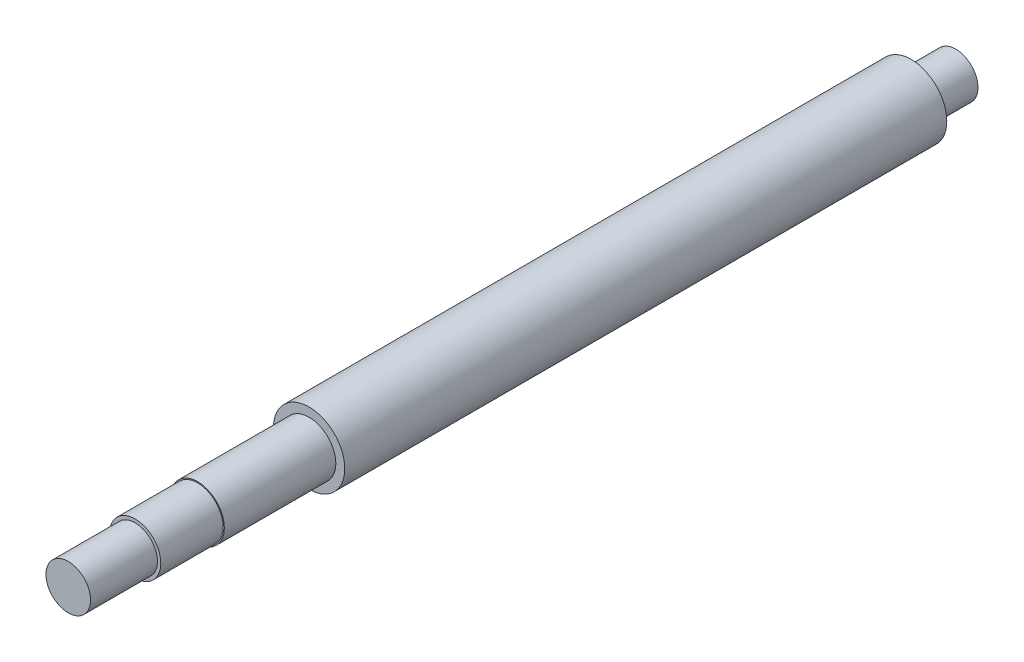
ISO-10303-21;
HEADER;
FILE_DESCRIPTION(('STEP AP214'),'2;1');
FILE_NAME('part.step','',(''),(''),'','','');
FILE_SCHEMA(('AUTOMOTIVE_DESIGN { 1 0 10303 214 1 1 1 1 }'));
ENDSEC;
DATA;
#1=APPLICATION_CONTEXT('core data for automotive mechanical design processes');
#2=APPLICATION_PROTOCOL_DEFINITION('international standard','automotive_design',2000,#1);
#3=PRODUCT_CONTEXT('',#1,'mechanical');
#4=PRODUCT('Part','Part','',(#3));
#5=PRODUCT_RELATED_PRODUCT_CATEGORY('part','',(#4));
#6=PRODUCT_DEFINITION_FORMATION('','',#4);
#7=PRODUCT_DEFINITION_CONTEXT('part definition',#1,'design');
#8=PRODUCT_DEFINITION('design','',#6,#7);
#9=PRODUCT_DEFINITION_SHAPE('','',#8);
#10=(LENGTH_UNIT() NAMED_UNIT(*) SI_UNIT(.MILLI.,.METRE.));
#11=(NAMED_UNIT(*) PLANE_ANGLE_UNIT() SI_UNIT($,.RADIAN.));
#12=(NAMED_UNIT(*) SI_UNIT($,.STERADIAN.) SOLID_ANGLE_UNIT());
#13=UNCERTAINTY_MEASURE_WITH_UNIT(LENGTH_MEASURE(1.E-05),#10,'distance_accuracy_value','');
#14=(GEOMETRIC_REPRESENTATION_CONTEXT(3) GLOBAL_UNCERTAINTY_ASSIGNED_CONTEXT((#13)) GLOBAL_UNIT_ASSIGNED_CONTEXT((#10,
#11,#12)) REPRESENTATION_CONTEXT('',''));
#15=CARTESIAN_POINT('',(0.,0.,0.));
#16=DIRECTION('',(0.,0.,1.));
#17=DIRECTION('',(1.,0.,0.));
#18=AXIS2_PLACEMENT_3D('',#15,#16,#17);
#19=CARTESIAN_POINT('',(0.,0.,10.));
#20=DIRECTION('',(0.,0.,-1.));
#21=DIRECTION('',(-1.,0.,0.));
#22=AXIS2_PLACEMENT_3D('',#19,#20,#21);
#23=CYLINDRICAL_SURFACE('',#22,5.);
#24=CARTESIAN_POINT('',(0.,0.,10.));
#25=DIRECTION('',(0.,0.,1.));
#26=DIRECTION('',(1.,0.,0.));
#27=AXIS2_PLACEMENT_3D('',#24,#25,#26);
#28=CIRCLE('',#27,5.);
#29=CARTESIAN_POINT('',(5.,0.,10.));
#30=VERTEX_POINT('',#29);
#31=EDGE_CURVE('E64',#30,#30,#28,.T.);
#32=ORIENTED_EDGE('',*,*,#31,.F.);
#33=EDGE_LOOP('',(#32));
#34=FACE_BOUND('',#33,.T.);
#35=CARTESIAN_POINT('',(0.,0.,0.));
#36=DIRECTION('',(0.,0.,1.));
#37=DIRECTION('',(1.,0.,0.));
#38=AXIS2_PLACEMENT_3D('',#35,#36,#37);
#39=CIRCLE('',#38,5.);
#40=CARTESIAN_POINT('',(5.,0.,0.));
#41=VERTEX_POINT('',#40);
#42=EDGE_CURVE('E41',#41,#41,#39,.T.);
#43=ORIENTED_EDGE('',*,*,#42,.T.);
#44=EDGE_LOOP('',(#43));
#45=FACE_BOUND('',#44,.T.);
#46=ADVANCED_FACE('F38',(#34,#45),#23,.T.);
#47=CARTESIAN_POINT('',(0.,0.,0.));
#48=DIRECTION('',(0.,0.,1.));
#49=DIRECTION('',(1.,0.,0.));
#50=AXIS2_PLACEMENT_3D('',#47,#48,#49);
#51=PLANE('',#50);
#52=ORIENTED_EDGE('',*,*,#42,.F.);
#53=EDGE_LOOP('',(#52));
#54=FACE_BOUND('',#53,.T.);
#55=ADVANCED_FACE('F76',(#54),#51,.F.);
#56=CARTESIAN_POINT('',(0.,0.,145.));
#57=DIRECTION('',(0.,0.,-1.));
#58=DIRECTION('',(-1.,0.,0.));
#59=AXIS2_PLACEMENT_3D('',#56,#57,#58);
#60=CYLINDRICAL_SURFACE('',#59,8.);
#61=CARTESIAN_POINT('',(0.,0.,145.));
#62=DIRECTION('',(0.,0.,1.));
#63=DIRECTION('',(1.,0.,0.));
#64=AXIS2_PLACEMENT_3D('',#61,#62,#63);
#65=CIRCLE('',#64,8.);
#66=CARTESIAN_POINT('',(8.,0.,145.));
#67=VERTEX_POINT('',#66);
#68=EDGE_CURVE('E65',#67,#67,#65,.T.);
#69=ORIENTED_EDGE('',*,*,#68,.F.);
#70=EDGE_LOOP('',(#69));
#71=FACE_BOUND('',#70,.T.);
#72=CARTESIAN_POINT('',(0.,0.,10.));
#73=DIRECTION('',(0.,0.,1.));
#74=DIRECTION('',(1.,0.,0.));
#75=AXIS2_PLACEMENT_3D('',#72,#73,#74);
#76=CIRCLE('',#75,8.);
#77=CARTESIAN_POINT('',(8.,0.,10.));
#78=VERTEX_POINT('',#77);
#79=EDGE_CURVE('E61',#78,#78,#76,.T.);
#80=ORIENTED_EDGE('',*,*,#79,.T.);
#81=EDGE_LOOP('',(#80));
#82=FACE_BOUND('',#81,.T.);
#83=ADVANCED_FACE('F78',(#71,#82),#60,.T.);
#84=CARTESIAN_POINT('',(0.,0.,145.));
#85=DIRECTION('',(0.,0.,1.));
#86=DIRECTION('',(1.,0.,0.));
#87=AXIS2_PLACEMENT_3D('',#84,#85,#86);
#88=PLANE('',#87);
#89=CARTESIAN_POINT('',(0.,0.,145.));
#90=DIRECTION('',(0.,0.,1.));
#91=DIRECTION('',(1.,0.,0.));
#92=AXIS2_PLACEMENT_3D('',#89,#90,#91);
#93=CIRCLE('',#92,6.);
#94=CARTESIAN_POINT('',(6.,0.,145.));
#95=VERTEX_POINT('',#94);
#96=EDGE_CURVE('E50',#95,#95,#93,.T.);
#97=ORIENTED_EDGE('',*,*,#96,.F.);
#98=EDGE_LOOP('',(#97));
#99=FACE_BOUND('',#98,.T.);
#100=ORIENTED_EDGE('',*,*,#68,.T.);
#101=EDGE_LOOP('',(#100));
#102=FACE_BOUND('',#101,.T.);
#103=ADVANCED_FACE('F83',(#99,#102),#88,.T.);
#104=CARTESIAN_POINT('',(0.,0.,10.));
#105=DIRECTION('',(0.,0.,1.));
#106=DIRECTION('',(1.,0.,0.));
#107=AXIS2_PLACEMENT_3D('',#104,#105,#106);
#108=PLANE('',#107);
#109=ORIENTED_EDGE('',*,*,#31,.T.);
#110=EDGE_LOOP('',(#109));
#111=FACE_BOUND('',#110,.T.);
#112=ORIENTED_EDGE('',*,*,#79,.F.);
#113=EDGE_LOOP('',(#112));
#114=FACE_BOUND('',#113,.T.);
#115=ADVANCED_FACE('F88',(#111,#114),#108,.F.);
#116=CARTESIAN_POINT('',(0.,0.,170.));
#117=DIRECTION('',(0.,0.,-1.));
#118=DIRECTION('',(-1.,0.,0.));
#119=AXIS2_PLACEMENT_3D('',#116,#117,#118);
#120=CYLINDRICAL_SURFACE('',#119,6.);
#121=CARTESIAN_POINT('',(0.,0.,170.));
#122=DIRECTION('',(0.,0.,1.));
#123=DIRECTION('',(1.,0.,0.));
#124=AXIS2_PLACEMENT_3D('',#121,#122,#123);
#125=CIRCLE('',#124,6.);
#126=CARTESIAN_POINT('',(6.,0.,170.));
#127=VERTEX_POINT('',#126);
#128=EDGE_CURVE('E57',#127,#127,#125,.T.);
#129=ORIENTED_EDGE('',*,*,#128,.F.);
#130=EDGE_LOOP('',(#129));
#131=FACE_BOUND('',#130,.T.);
#132=ORIENTED_EDGE('',*,*,#96,.T.);
#133=EDGE_LOOP('',(#132));
#134=FACE_BOUND('',#133,.T.);
#135=ADVANCED_FACE('F91',(#131,#134),#120,.T.);
#136=CARTESIAN_POINT('',(0.,0.,170.));
#137=DIRECTION('',(0.,0.,1.));
#138=DIRECTION('',(1.,0.,0.));
#139=AXIS2_PLACEMENT_3D('',#136,#137,#138);
#140=PLANE('',#139);
#141=CARTESIAN_POINT('',(0.,0.,170.));
#142=DIRECTION('',(0.,0.,1.));
#143=DIRECTION('',(1.,0.,0.));
#144=AXIS2_PLACEMENT_3D('',#141,#142,#143);
#145=CIRCLE('',#144,5.75);
#146=CARTESIAN_POINT('',(5.75,0.,170.));
#147=VERTEX_POINT('',#146);
#148=EDGE_CURVE('E45',#147,#147,#145,.T.);
#149=ORIENTED_EDGE('',*,*,#148,.F.);
#150=EDGE_LOOP('',(#149));
#151=FACE_BOUND('',#150,.T.);
#152=ORIENTED_EDGE('',*,*,#128,.T.);
#153=EDGE_LOOP('',(#152));
#154=FACE_BOUND('',#153,.T.);
#155=ADVANCED_FACE('F97',(#151,#154),#140,.T.);
#156=CARTESIAN_POINT('',(0.,0.,184.));
#157=DIRECTION('',(0.,0.,-1.));
#158=DIRECTION('',(-1.,0.,0.));
#159=AXIS2_PLACEMENT_3D('',#156,#157,#158);
#160=CYLINDRICAL_SURFACE('',#159,5.75);
#161=CARTESIAN_POINT('',(0.,0.,184.));
#162=DIRECTION('',(0.,0.,1.));
#163=DIRECTION('',(1.,0.,0.));
#164=AXIS2_PLACEMENT_3D('',#161,#162,#163);
#165=CIRCLE('',#164,5.75);
#166=CARTESIAN_POINT('',(5.75,0.,184.));
#167=VERTEX_POINT('',#166);
#168=EDGE_CURVE('E55',#167,#167,#165,.T.);
#169=ORIENTED_EDGE('',*,*,#168,.F.);
#170=EDGE_LOOP('',(#169));
#171=FACE_BOUND('',#170,.T.);
#172=ORIENTED_EDGE('',*,*,#148,.T.);
#173=EDGE_LOOP('',(#172));
#174=FACE_BOUND('',#173,.T.);
#175=ADVANCED_FACE('F101',(#171,#174),#160,.T.);
#176=CARTESIAN_POINT('',(0.,0.,184.));
#177=DIRECTION('',(0.,0.,1.));
#178=DIRECTION('',(1.,0.,0.));
#179=AXIS2_PLACEMENT_3D('',#176,#177,#178);
#180=PLANE('',#179);
#181=CARTESIAN_POINT('',(0.,0.,184.));
#182=DIRECTION('',(0.,0.,1.));
#183=DIRECTION('',(1.,0.,0.));
#184=AXIS2_PLACEMENT_3D('',#181,#182,#183);
#185=CIRCLE('',#184,5.);
#186=CARTESIAN_POINT('',(5.,0.,184.));
#187=VERTEX_POINT('',#186);
#188=EDGE_CURVE('E10',#187,#187,#185,.T.);
#189=ORIENTED_EDGE('',*,*,#188,.F.);
#190=EDGE_LOOP('',(#189));
#191=FACE_BOUND('',#190,.T.);
#192=ORIENTED_EDGE('',*,*,#168,.T.);
#193=EDGE_LOOP('',(#192));
#194=FACE_BOUND('',#193,.T.);
#195=ADVANCED_FACE('F105',(#191,#194),#180,.T.);
#196=CARTESIAN_POINT('',(0.,0.,199.));
#197=DIRECTION('',(0.,0.,-1.));
#198=DIRECTION('',(-1.,0.,0.));
#199=AXIS2_PLACEMENT_3D('',#196,#197,#198);
#200=CYLINDRICAL_SURFACE('',#199,5.);
#201=CARTESIAN_POINT('',(0.,0.,199.));
#202=DIRECTION('',(0.,0.,1.));
#203=DIRECTION('',(1.,0.,0.));
#204=AXIS2_PLACEMENT_3D('',#201,#202,#203);
#205=CIRCLE('',#204,5.);
#206=CARTESIAN_POINT('',(5.,0.,199.));
#207=VERTEX_POINT('',#206);
#208=EDGE_CURVE('E54',#207,#207,#205,.T.);
#209=ORIENTED_EDGE('',*,*,#208,.F.);
#210=EDGE_LOOP('',(#209));
#211=FACE_BOUND('',#210,.T.);
#212=ORIENTED_EDGE('',*,*,#188,.T.);
#213=EDGE_LOOP('',(#212));
#214=FACE_BOUND('',#213,.T.);
#215=ADVANCED_FACE('F109',(#211,#214),#200,.T.);
#216=CARTESIAN_POINT('',(0.,0.,199.));
#217=DIRECTION('',(0.,0.,1.));
#218=DIRECTION('',(1.,0.,0.));
#219=AXIS2_PLACEMENT_3D('',#216,#217,#218);
#220=PLANE('',#219);
#221=ORIENTED_EDGE('',*,*,#208,.T.);
#222=EDGE_LOOP('',(#221));
#223=FACE_BOUND('',#222,.T.);
#224=ADVANCED_FACE('F113',(#223),#220,.T.);
#225=CLOSED_SHELL('',(#46,#55,#83,#103,#115,#135,#155,#175,#195,#215,#224));
#226=MANIFOLD_SOLID_BREP('B2',#225);
#227=ADVANCED_BREP_SHAPE_REPRESENTATION('',(#18,#226),#14);
#228=SHAPE_DEFINITION_REPRESENTATION(#9,#227);
ENDSEC;
END-ISO-10303-21;
